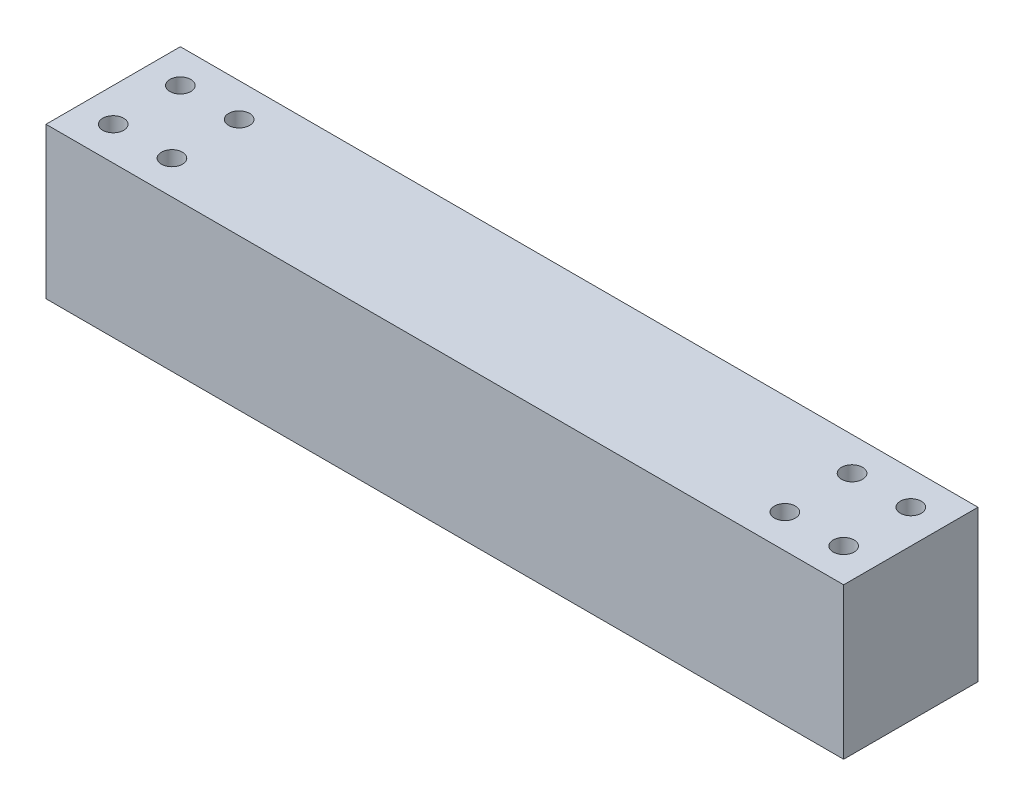
ISO-10303-21;
HEADER;
FILE_DESCRIPTION(('STEP AP214'),'2;1');
FILE_NAME('part.step','',(''),(''),'','','');
FILE_SCHEMA(('AUTOMOTIVE_DESIGN { 1 0 10303 214 1 1 1 1 }'));
ENDSEC;
DATA;
#1=APPLICATION_CONTEXT('core data for automotive mechanical design processes');
#2=APPLICATION_PROTOCOL_DEFINITION('international standard','automotive_design',2000,#1);
#3=PRODUCT_CONTEXT('',#1,'mechanical');
#4=PRODUCT('Part','Part','',(#3));
#5=PRODUCT_RELATED_PRODUCT_CATEGORY('part','',(#4));
#6=PRODUCT_DEFINITION_FORMATION('','',#4);
#7=PRODUCT_DEFINITION_CONTEXT('part definition',#1,'design');
#8=PRODUCT_DEFINITION('design','',#6,#7);
#9=PRODUCT_DEFINITION_SHAPE('','',#8);
#10=(LENGTH_UNIT() NAMED_UNIT(*) SI_UNIT(.MILLI.,.METRE.));
#11=(NAMED_UNIT(*) PLANE_ANGLE_UNIT() SI_UNIT($,.RADIAN.));
#12=(NAMED_UNIT(*) SI_UNIT($,.STERADIAN.) SOLID_ANGLE_UNIT());
#13=UNCERTAINTY_MEASURE_WITH_UNIT(LENGTH_MEASURE(1.E-05),#10,'distance_accuracy_value','');
#14=(GEOMETRIC_REPRESENTATION_CONTEXT(3) GLOBAL_UNCERTAINTY_ASSIGNED_CONTEXT((#13)) GLOBAL_UNIT_ASSIGNED_CONTEXT((#10,
#11,#12)) REPRESENTATION_CONTEXT('',''));
#15=CARTESIAN_POINT('',(0.,0.,0.));
#16=DIRECTION('',(0.,0.,1.));
#17=DIRECTION('',(1.,0.,0.));
#18=AXIS2_PLACEMENT_3D('',#15,#16,#17);
#19=CARTESIAN_POINT('',(0.,180.,160.));
#20=DIRECTION('',(0.,-1.,0.));
#21=DIRECTION('',(0.,0.,-1.));
#22=AXIS2_PLACEMENT_3D('',#19,#20,#21);
#23=PLANE('',#22);
#24=CARTESIAN_POINT('',(110.,180.,40.));
#25=DIRECTION('',(0.,1.,0.));
#26=DIRECTION('',(0.,0.,1.));
#27=AXIS2_PLACEMENT_3D('',#24,#25,#26);
#28=CIRCLE('',#27,12.5);
#29=CARTESIAN_POINT('',(110.,180.,52.5));
#30=VERTEX_POINT('',#29);
#31=EDGE_CURVE('E175',#30,#30,#28,.T.);
#32=ORIENTED_EDGE('',*,*,#31,.F.);
#33=EDGE_LOOP('',(#32));
#34=FACE_BOUND('',#33,.T.);
#35=CARTESIAN_POINT('',(840.,180.,120.));
#36=DIRECTION('',(0.,1.,0.));
#37=DIRECTION('',(0.,0.,1.));
#38=AXIS2_PLACEMENT_3D('',#35,#36,#37);
#39=CIRCLE('',#38,12.5);
#40=CARTESIAN_POINT('',(840.,180.,132.5));
#41=VERTEX_POINT('',#40);
#42=EDGE_CURVE('E103',#41,#41,#39,.T.);
#43=ORIENTED_EDGE('',*,*,#42,.F.);
#44=EDGE_LOOP('',(#43));
#45=FACE_BOUND('',#44,.T.);
#46=DIRECTION('',(-1.,0.,0.));
#47=VECTOR('',#46,1.);
#48=CARTESIAN_POINT('',(0.,180.,0.));
#49=LINE('',#48,#47);
#50=CARTESIAN_POINT('',(950.,180.,0.));
#51=VERTEX_POINT('',#50);
#52=CARTESIAN_POINT('',(0.,180.,0.));
#53=VERTEX_POINT('',#52);
#54=EDGE_CURVE('E57',#51,#53,#49,.T.);
#55=ORIENTED_EDGE('',*,*,#54,.T.);
#56=DIRECTION('',(0.,0.,-1.));
#57=VECTOR('',#56,1.);
#58=CARTESIAN_POINT('',(0.,180.,160.));
#59=LINE('',#58,#57);
#60=CARTESIAN_POINT('',(0.,180.,160.));
#61=VERTEX_POINT('',#60);
#62=EDGE_CURVE('E77',#61,#53,#59,.T.);
#63=ORIENTED_EDGE('',*,*,#62,.F.);
#64=DIRECTION('',(-1.,0.,0.));
#65=VECTOR('',#64,1.);
#66=CARTESIAN_POINT('',(0.,180.,160.));
#67=LINE('',#66,#65);
#68=CARTESIAN_POINT('',(950.,180.,160.));
#69=VERTEX_POINT('',#68);
#70=EDGE_CURVE('E34',#69,#61,#67,.T.);
#71=ORIENTED_EDGE('',*,*,#70,.F.);
#72=DIRECTION('',(0.,0.,-1.));
#73=VECTOR('',#72,1.);
#74=CARTESIAN_POINT('',(950.,180.,160.));
#75=LINE('',#74,#73);
#76=EDGE_CURVE('E74',#69,#51,#75,.T.);
#77=ORIENTED_EDGE('',*,*,#76,.T.);
#78=EDGE_LOOP('',(#55,#63,#71,#77));
#79=FACE_BOUND('',#78,.T.);
#80=CARTESIAN_POINT('',(910.,180.,120.));
#81=DIRECTION('',(0.,1.,0.));
#82=DIRECTION('',(0.,0.,1.));
#83=AXIS2_PLACEMENT_3D('',#80,#81,#82);
#84=CIRCLE('',#83,12.5);
#85=CARTESIAN_POINT('',(910.,180.,132.5));
#86=VERTEX_POINT('',#85);
#87=EDGE_CURVE('E115',#86,#86,#84,.T.);
#88=ORIENTED_EDGE('',*,*,#87,.F.);
#89=EDGE_LOOP('',(#88));
#90=FACE_BOUND('',#89,.T.);
#91=CARTESIAN_POINT('',(910.,180.,40.));
#92=DIRECTION('',(0.,1.,0.));
#93=DIRECTION('',(0.,0.,1.));
#94=AXIS2_PLACEMENT_3D('',#91,#92,#93);
#95=CIRCLE('',#94,12.5);
#96=CARTESIAN_POINT('',(910.,180.,52.5));
#97=VERTEX_POINT('',#96);
#98=EDGE_CURVE('E127',#97,#97,#95,.T.);
#99=ORIENTED_EDGE('',*,*,#98,.F.);
#100=EDGE_LOOP('',(#99));
#101=FACE_BOUND('',#100,.T.);
#102=CARTESIAN_POINT('',(840.,180.,40.));
#103=DIRECTION('',(0.,1.,0.));
#104=DIRECTION('',(0.,0.,1.));
#105=AXIS2_PLACEMENT_3D('',#102,#103,#104);
#106=CIRCLE('',#105,12.5);
#107=CARTESIAN_POINT('',(840.,180.,52.5));
#108=VERTEX_POINT('',#107);
#109=EDGE_CURVE('E139',#108,#108,#106,.T.);
#110=ORIENTED_EDGE('',*,*,#109,.F.);
#111=EDGE_LOOP('',(#110));
#112=FACE_BOUND('',#111,.T.);
#113=CARTESIAN_POINT('',(110.,180.,120.));
#114=DIRECTION('',(0.,1.,0.));
#115=DIRECTION('',(0.,0.,1.));
#116=AXIS2_PLACEMENT_3D('',#113,#114,#115);
#117=CIRCLE('',#116,12.5);
#118=CARTESIAN_POINT('',(110.,180.,132.5));
#119=VERTEX_POINT('',#118);
#120=EDGE_CURVE('E151',#119,#119,#117,.T.);
#121=ORIENTED_EDGE('',*,*,#120,.F.);
#122=EDGE_LOOP('',(#121));
#123=FACE_BOUND('',#122,.T.);
#124=CARTESIAN_POINT('',(40.,180.,120.));
#125=DIRECTION('',(0.,1.,0.));
#126=DIRECTION('',(0.,0.,1.));
#127=AXIS2_PLACEMENT_3D('',#124,#125,#126);
#128=CIRCLE('',#127,12.5);
#129=CARTESIAN_POINT('',(40.,180.,132.5));
#130=VERTEX_POINT('',#129);
#131=EDGE_CURVE('E163',#130,#130,#128,.T.);
#132=ORIENTED_EDGE('',*,*,#131,.F.);
#133=EDGE_LOOP('',(#132));
#134=FACE_BOUND('',#133,.T.);
#135=CARTESIAN_POINT('',(40.,180.,40.));
#136=DIRECTION('',(0.,1.,0.));
#137=DIRECTION('',(0.,0.,1.));
#138=AXIS2_PLACEMENT_3D('',#135,#136,#137);
#139=CIRCLE('',#138,12.5);
#140=CARTESIAN_POINT('',(40.,180.,52.5));
#141=VERTEX_POINT('',#140);
#142=EDGE_CURVE('E187',#141,#141,#139,.T.);
#143=ORIENTED_EDGE('',*,*,#142,.F.);
#144=EDGE_LOOP('',(#143));
#145=FACE_BOUND('',#144,.T.);
#146=ADVANCED_FACE('F17',(#34,#45,#79,#90,#101,#112,#123,#134,#145),#23,.F.);
#147=CARTESIAN_POINT('',(0.,0.,160.));
#148=DIRECTION('',(1.,0.,0.));
#149=DIRECTION('',(0.,0.,-1.));
#150=AXIS2_PLACEMENT_3D('',#147,#148,#149);
#151=PLANE('',#150);
#152=DIRECTION('',(0.,-1.,0.));
#153=VECTOR('',#152,1.);
#154=CARTESIAN_POINT('',(0.,0.,0.));
#155=LINE('',#154,#153);
#156=CARTESIAN_POINT('',(0.,0.,0.));
#157=VERTEX_POINT('',#156);
#158=EDGE_CURVE('E81',#53,#157,#155,.T.);
#159=ORIENTED_EDGE('',*,*,#158,.T.);
#160=DIRECTION('',(0.,0.,-1.));
#161=VECTOR('',#160,1.);
#162=CARTESIAN_POINT('',(0.,0.,160.));
#163=LINE('',#162,#161);
#164=CARTESIAN_POINT('',(0.,0.,160.));
#165=VERTEX_POINT('',#164);
#166=EDGE_CURVE('E11',#165,#157,#163,.T.);
#167=ORIENTED_EDGE('',*,*,#166,.F.);
#168=DIRECTION('',(0.,-1.,0.));
#169=VECTOR('',#168,1.);
#170=CARTESIAN_POINT('',(0.,0.,160.));
#171=LINE('',#170,#169);
#172=EDGE_CURVE('E69',#61,#165,#171,.T.);
#173=ORIENTED_EDGE('',*,*,#172,.F.);
#174=ORIENTED_EDGE('',*,*,#62,.T.);
#175=EDGE_LOOP('',(#159,#167,#173,#174));
#176=FACE_BOUND('',#175,.T.);
#177=ADVANCED_FACE('F19',(#176),#151,.F.);
#178=CARTESIAN_POINT('',(0.,0.,160.));
#179=DIRECTION('',(0.,1.,0.));
#180=DIRECTION('',(0.,0.,1.));
#181=AXIS2_PLACEMENT_3D('',#178,#179,#180);
#182=PLANE('',#181);
#183=CARTESIAN_POINT('',(40.,0.,40.));
#184=DIRECTION('',(0.,1.,0.));
#185=DIRECTION('',(0.,0.,1.));
#186=AXIS2_PLACEMENT_3D('',#183,#184,#185);
#187=CIRCLE('',#186,6.75);
#188=CARTESIAN_POINT('',(40.,0.,46.75));
#189=VERTEX_POINT('',#188);
#190=EDGE_CURVE('E178',#189,#189,#187,.T.);
#191=ORIENTED_EDGE('',*,*,#190,.T.);
#192=EDGE_LOOP('',(#191));
#193=FACE_BOUND('',#192,.T.);
#194=CARTESIAN_POINT('',(110.,0.,40.));
#195=DIRECTION('',(0.,1.,0.));
#196=DIRECTION('',(0.,0.,1.));
#197=AXIS2_PLACEMENT_3D('',#194,#195,#196);
#198=CIRCLE('',#197,6.75);
#199=CARTESIAN_POINT('',(110.,0.,46.75));
#200=VERTEX_POINT('',#199);
#201=EDGE_CURVE('E166',#200,#200,#198,.T.);
#202=ORIENTED_EDGE('',*,*,#201,.T.);
#203=EDGE_LOOP('',(#202));
#204=FACE_BOUND('',#203,.T.);
#205=CARTESIAN_POINT('',(40.,0.,120.));
#206=DIRECTION('',(0.,1.,0.));
#207=DIRECTION('',(0.,0.,1.));
#208=AXIS2_PLACEMENT_3D('',#205,#206,#207);
#209=CIRCLE('',#208,6.75);
#210=CARTESIAN_POINT('',(40.,0.,126.75));
#211=VERTEX_POINT('',#210);
#212=EDGE_CURVE('E154',#211,#211,#209,.T.);
#213=ORIENTED_EDGE('',*,*,#212,.T.);
#214=EDGE_LOOP('',(#213));
#215=FACE_BOUND('',#214,.T.);
#216=CARTESIAN_POINT('',(110.,0.,120.));
#217=DIRECTION('',(0.,1.,0.));
#218=DIRECTION('',(0.,0.,1.));
#219=AXIS2_PLACEMENT_3D('',#216,#217,#218);
#220=CIRCLE('',#219,6.75);
#221=CARTESIAN_POINT('',(110.,0.,126.75));
#222=VERTEX_POINT('',#221);
#223=EDGE_CURVE('E142',#222,#222,#220,.T.);
#224=ORIENTED_EDGE('',*,*,#223,.T.);
#225=EDGE_LOOP('',(#224));
#226=FACE_BOUND('',#225,.T.);
#227=CARTESIAN_POINT('',(840.,0.,40.));
#228=DIRECTION('',(0.,1.,0.));
#229=DIRECTION('',(0.,0.,1.));
#230=AXIS2_PLACEMENT_3D('',#227,#228,#229);
#231=CIRCLE('',#230,6.74999999999992);
#232=CARTESIAN_POINT('',(840.,0.,46.7499999999999));
#233=VERTEX_POINT('',#232);
#234=EDGE_CURVE('E130',#233,#233,#231,.T.);
#235=ORIENTED_EDGE('',*,*,#234,.T.);
#236=EDGE_LOOP('',(#235));
#237=FACE_BOUND('',#236,.T.);
#238=CARTESIAN_POINT('',(910.,0.,40.));
#239=DIRECTION('',(0.,1.,0.));
#240=DIRECTION('',(0.,0.,1.));
#241=AXIS2_PLACEMENT_3D('',#238,#239,#240);
#242=CIRCLE('',#241,6.74999999999992);
#243=CARTESIAN_POINT('',(910.,0.,46.7499999999999));
#244=VERTEX_POINT('',#243);
#245=EDGE_CURVE('E118',#244,#244,#242,.T.);
#246=ORIENTED_EDGE('',*,*,#245,.T.);
#247=EDGE_LOOP('',(#246));
#248=FACE_BOUND('',#247,.T.);
#249=CARTESIAN_POINT('',(910.,0.,120.));
#250=DIRECTION('',(0.,1.,0.));
#251=DIRECTION('',(0.,0.,1.));
#252=AXIS2_PLACEMENT_3D('',#249,#250,#251);
#253=CIRCLE('',#252,6.74999999999992);
#254=CARTESIAN_POINT('',(910.,0.,126.75));
#255=VERTEX_POINT('',#254);
#256=EDGE_CURVE('E106',#255,#255,#253,.T.);
#257=ORIENTED_EDGE('',*,*,#256,.T.);
#258=EDGE_LOOP('',(#257));
#259=FACE_BOUND('',#258,.T.);
#260=CARTESIAN_POINT('',(840.,0.,120.));
#261=DIRECTION('',(0.,1.,0.));
#262=DIRECTION('',(0.,0.,1.));
#263=AXIS2_PLACEMENT_3D('',#260,#261,#262);
#264=CIRCLE('',#263,6.74999999999992);
#265=CARTESIAN_POINT('',(840.,0.,126.75));
#266=VERTEX_POINT('',#265);
#267=EDGE_CURVE('E84',#266,#266,#264,.T.);
#268=ORIENTED_EDGE('',*,*,#267,.T.);
#269=EDGE_LOOP('',(#268));
#270=FACE_BOUND('',#269,.T.);
#271=DIRECTION('',(1.,0.,0.));
#272=VECTOR('',#271,1.);
#273=CARTESIAN_POINT('',(0.,0.,0.));
#274=LINE('',#273,#272);
#275=CARTESIAN_POINT('',(950.,0.,0.));
#276=VERTEX_POINT('',#275);
#277=EDGE_CURVE('E73',#157,#276,#274,.T.);
#278=ORIENTED_EDGE('',*,*,#277,.T.);
#279=DIRECTION('',(0.,0.,-1.));
#280=VECTOR('',#279,1.);
#281=CARTESIAN_POINT('',(950.,0.,160.));
#282=LINE('',#281,#280);
#283=CARTESIAN_POINT('',(950.,0.,160.));
#284=VERTEX_POINT('',#283);
#285=EDGE_CURVE('E26',#284,#276,#282,.T.);
#286=ORIENTED_EDGE('',*,*,#285,.F.);
#287=DIRECTION('',(1.,0.,0.));
#288=VECTOR('',#287,1.);
#289=CARTESIAN_POINT('',(0.,0.,160.));
#290=LINE('',#289,#288);
#291=EDGE_CURVE('E64',#165,#284,#290,.T.);
#292=ORIENTED_EDGE('',*,*,#291,.F.);
#293=ORIENTED_EDGE('',*,*,#166,.T.);
#294=EDGE_LOOP('',(#278,#286,#292,#293));
#295=FACE_BOUND('',#294,.T.);
#296=ADVANCED_FACE('F72',(#193,#204,#215,#226,#237,#248,#259,#270,#295),#182,.F.);
#297=CARTESIAN_POINT('',(950.,0.,160.));
#298=DIRECTION('',(-1.,0.,0.));
#299=DIRECTION('',(0.,0.,1.));
#300=AXIS2_PLACEMENT_3D('',#297,#298,#299);
#301=PLANE('',#300);
#302=DIRECTION('',(0.,1.,0.));
#303=VECTOR('',#302,1.);
#304=CARTESIAN_POINT('',(950.,0.,0.));
#305=LINE('',#304,#303);
#306=EDGE_CURVE('E51',#276,#51,#305,.T.);
#307=ORIENTED_EDGE('',*,*,#306,.T.);
#308=ORIENTED_EDGE('',*,*,#76,.F.);
#309=DIRECTION('',(0.,1.,0.));
#310=VECTOR('',#309,1.);
#311=CARTESIAN_POINT('',(950.,0.,160.));
#312=LINE('',#311,#310);
#313=EDGE_CURVE('E67',#284,#69,#312,.T.);
#314=ORIENTED_EDGE('',*,*,#313,.F.);
#315=ORIENTED_EDGE('',*,*,#285,.T.);
#316=EDGE_LOOP('',(#307,#308,#314,#315));
#317=FACE_BOUND('',#316,.T.);
#318=ADVANCED_FACE('F75',(#317),#301,.F.);
#319=CARTESIAN_POINT('',(0.,0.,160.));
#320=DIRECTION('',(0.,0.,-1.));
#321=DIRECTION('',(-1.,0.,0.));
#322=AXIS2_PLACEMENT_3D('',#319,#320,#321);
#323=PLANE('',#322);
#324=ORIENTED_EDGE('',*,*,#172,.T.);
#325=ORIENTED_EDGE('',*,*,#291,.T.);
#326=ORIENTED_EDGE('',*,*,#313,.T.);
#327=ORIENTED_EDGE('',*,*,#70,.T.);
#328=EDGE_LOOP('',(#324,#325,#326,#327));
#329=FACE_BOUND('',#328,.T.);
#330=ADVANCED_FACE('F65',(#329),#323,.F.);
#331=CARTESIAN_POINT('',(0.,0.,0.));
#332=DIRECTION('',(0.,0.,-1.));
#333=DIRECTION('',(-1.,0.,0.));
#334=AXIS2_PLACEMENT_3D('',#331,#332,#333);
#335=PLANE('',#334);
#336=ORIENTED_EDGE('',*,*,#158,.F.);
#337=ORIENTED_EDGE('',*,*,#54,.F.);
#338=ORIENTED_EDGE('',*,*,#306,.F.);
#339=ORIENTED_EDGE('',*,*,#277,.F.);
#340=EDGE_LOOP('',(#336,#337,#338,#339));
#341=FACE_BOUND('',#340,.T.);
#342=ADVANCED_FACE('F92',(#341),#335,.T.);
#343=CARTESIAN_POINT('',(840.,180.,120.));
#344=DIRECTION('',(0.,1.,0.));
#345=DIRECTION('',(0.,0.,1.));
#346=AXIS2_PLACEMENT_3D('',#343,#344,#345);
#347=CYLINDRICAL_SURFACE('',#346,6.74999999999992);
#348=ORIENTED_EDGE('',*,*,#267,.F.);
#349=EDGE_LOOP('',(#348));
#350=FACE_BOUND('',#349,.T.);
#351=CARTESIAN_POINT('',(840.,80.,120.));
#352=DIRECTION('',(0.,1.,0.));
#353=DIRECTION('',(0.,0.,1.));
#354=AXIS2_PLACEMENT_3D('',#351,#352,#353);
#355=CIRCLE('',#354,6.74999999999992);
#356=CARTESIAN_POINT('',(840.,80.,126.75));
#357=VERTEX_POINT('',#356);
#358=EDGE_CURVE('E97',#357,#357,#355,.T.);
#359=ORIENTED_EDGE('',*,*,#358,.T.);
#360=EDGE_LOOP('',(#359));
#361=FACE_BOUND('',#360,.T.);
#362=ADVANCED_FACE('F226',(#350,#361),#347,.F.);
#363=CARTESIAN_POINT('',(846.75,80.,120.));
#364=DIRECTION('',(0.,-1.,0.));
#365=DIRECTION('',(0.,0.,-1.));
#366=AXIS2_PLACEMENT_3D('',#363,#364,#365);
#367=PLANE('',#366);
#368=ORIENTED_EDGE('',*,*,#358,.F.);
#369=EDGE_LOOP('',(#368));
#370=FACE_BOUND('',#369,.T.);
#371=CARTESIAN_POINT('',(840.,80.,120.));
#372=DIRECTION('',(0.,1.,0.));
#373=DIRECTION('',(0.,0.,1.));
#374=AXIS2_PLACEMENT_3D('',#371,#372,#373);
#375=CIRCLE('',#374,12.5);
#376=CARTESIAN_POINT('',(840.,80.,132.5));
#377=VERTEX_POINT('',#376);
#378=EDGE_CURVE('E100',#377,#377,#375,.T.);
#379=ORIENTED_EDGE('',*,*,#378,.T.);
#380=EDGE_LOOP('',(#379));
#381=FACE_BOUND('',#380,.T.);
#382=ADVANCED_FACE('F229',(#370,#381),#367,.F.);
#383=CARTESIAN_POINT('',(840.,180.,120.));
#384=DIRECTION('',(0.,1.,0.));
#385=DIRECTION('',(0.,0.,1.));
#386=AXIS2_PLACEMENT_3D('',#383,#384,#385);
#387=CYLINDRICAL_SURFACE('',#386,12.5);
#388=ORIENTED_EDGE('',*,*,#378,.F.);
#389=EDGE_LOOP('',(#388));
#390=FACE_BOUND('',#389,.T.);
#391=ORIENTED_EDGE('',*,*,#42,.T.);
#392=EDGE_LOOP('',(#391));
#393=FACE_BOUND('',#392,.T.);
#394=ADVANCED_FACE('F235',(#390,#393),#387,.F.);
#395=CARTESIAN_POINT('',(910.,180.,120.));
#396=DIRECTION('',(0.,1.,0.));
#397=DIRECTION('',(0.,0.,1.));
#398=AXIS2_PLACEMENT_3D('',#395,#396,#397);
#399=CYLINDRICAL_SURFACE('',#398,6.74999999999992);
#400=ORIENTED_EDGE('',*,*,#256,.F.);
#401=EDGE_LOOP('',(#400));
#402=FACE_BOUND('',#401,.T.);
#403=CARTESIAN_POINT('',(910.,80.,120.));
#404=DIRECTION('',(0.,1.,0.));
#405=DIRECTION('',(0.,0.,1.));
#406=AXIS2_PLACEMENT_3D('',#403,#404,#405);
#407=CIRCLE('',#406,6.74999999999992);
#408=CARTESIAN_POINT('',(910.,80.,126.75));
#409=VERTEX_POINT('',#408);
#410=EDGE_CURVE('E109',#409,#409,#407,.T.);
#411=ORIENTED_EDGE('',*,*,#410,.T.);
#412=EDGE_LOOP('',(#411));
#413=FACE_BOUND('',#412,.T.);
#414=ADVANCED_FACE('F241',(#402,#413),#399,.F.);
#415=CARTESIAN_POINT('',(916.75,80.,120.));
#416=DIRECTION('',(0.,-1.,0.));
#417=DIRECTION('',(0.,0.,-1.));
#418=AXIS2_PLACEMENT_3D('',#415,#416,#417);
#419=PLANE('',#418);
#420=ORIENTED_EDGE('',*,*,#410,.F.);
#421=EDGE_LOOP('',(#420));
#422=FACE_BOUND('',#421,.T.);
#423=CARTESIAN_POINT('',(910.,80.,120.));
#424=DIRECTION('',(0.,1.,0.));
#425=DIRECTION('',(0.,0.,1.));
#426=AXIS2_PLACEMENT_3D('',#423,#424,#425);
#427=CIRCLE('',#426,12.5);
#428=CARTESIAN_POINT('',(910.,80.,132.5));
#429=VERTEX_POINT('',#428);
#430=EDGE_CURVE('E112',#429,#429,#427,.T.);
#431=ORIENTED_EDGE('',*,*,#430,.T.);
#432=EDGE_LOOP('',(#431));
#433=FACE_BOUND('',#432,.T.);
#434=ADVANCED_FACE('F247',(#422,#433),#419,.F.);
#435=CARTESIAN_POINT('',(910.,180.,120.));
#436=DIRECTION('',(0.,1.,0.));
#437=DIRECTION('',(0.,0.,1.));
#438=AXIS2_PLACEMENT_3D('',#435,#436,#437);
#439=CYLINDRICAL_SURFACE('',#438,12.5);
#440=ORIENTED_EDGE('',*,*,#430,.F.);
#441=EDGE_LOOP('',(#440));
#442=FACE_BOUND('',#441,.T.);
#443=ORIENTED_EDGE('',*,*,#87,.T.);
#444=EDGE_LOOP('',(#443));
#445=FACE_BOUND('',#444,.T.);
#446=ADVANCED_FACE('F293',(#442,#445),#439,.F.);
#447=CARTESIAN_POINT('',(910.,180.,40.));
#448=DIRECTION('',(0.,1.,0.));
#449=DIRECTION('',(0.,0.,1.));
#450=AXIS2_PLACEMENT_3D('',#447,#448,#449);
#451=CYLINDRICAL_SURFACE('',#450,6.74999999999992);
#452=ORIENTED_EDGE('',*,*,#245,.F.);
#453=EDGE_LOOP('',(#452));
#454=FACE_BOUND('',#453,.T.);
#455=CARTESIAN_POINT('',(910.,80.,40.));
#456=DIRECTION('',(0.,1.,0.));
#457=DIRECTION('',(0.,0.,1.));
#458=AXIS2_PLACEMENT_3D('',#455,#456,#457);
#459=CIRCLE('',#458,6.74999999999992);
#460=CARTESIAN_POINT('',(910.,80.,46.7499999999999));
#461=VERTEX_POINT('',#460);
#462=EDGE_CURVE('E121',#461,#461,#459,.T.);
#463=ORIENTED_EDGE('',*,*,#462,.T.);
#464=EDGE_LOOP('',(#463));
#465=FACE_BOUND('',#464,.T.);
#466=ADVANCED_FACE('F302',(#454,#465),#451,.F.);
#467=CARTESIAN_POINT('',(916.75,80.,40.));
#468=DIRECTION('',(0.,-1.,0.));
#469=DIRECTION('',(0.,0.,-1.));
#470=AXIS2_PLACEMENT_3D('',#467,#468,#469);
#471=PLANE('',#470);
#472=ORIENTED_EDGE('',*,*,#462,.F.);
#473=EDGE_LOOP('',(#472));
#474=FACE_BOUND('',#473,.T.);
#475=CARTESIAN_POINT('',(910.,80.,40.));
#476=DIRECTION('',(0.,1.,0.));
#477=DIRECTION('',(0.,0.,1.));
#478=AXIS2_PLACEMENT_3D('',#475,#476,#477);
#479=CIRCLE('',#478,12.5);
#480=CARTESIAN_POINT('',(910.,80.,52.5));
#481=VERTEX_POINT('',#480);
#482=EDGE_CURVE('E124',#481,#481,#479,.T.);
#483=ORIENTED_EDGE('',*,*,#482,.T.);
#484=EDGE_LOOP('',(#483));
#485=FACE_BOUND('',#484,.T.);
#486=ADVANCED_FACE('F312',(#474,#485),#471,.F.);
#487=CARTESIAN_POINT('',(910.,180.,40.));
#488=DIRECTION('',(0.,1.,0.));
#489=DIRECTION('',(0.,0.,1.));
#490=AXIS2_PLACEMENT_3D('',#487,#488,#489);
#491=CYLINDRICAL_SURFACE('',#490,12.5);
#492=ORIENTED_EDGE('',*,*,#482,.F.);
#493=EDGE_LOOP('',(#492));
#494=FACE_BOUND('',#493,.T.);
#495=ORIENTED_EDGE('',*,*,#98,.T.);
#496=EDGE_LOOP('',(#495));
#497=FACE_BOUND('',#496,.T.);
#498=ADVANCED_FACE('F322',(#494,#497),#491,.F.);
#499=CARTESIAN_POINT('',(840.,180.,40.));
#500=DIRECTION('',(0.,1.,0.));
#501=DIRECTION('',(0.,0.,1.));
#502=AXIS2_PLACEMENT_3D('',#499,#500,#501);
#503=CYLINDRICAL_SURFACE('',#502,6.74999999999992);
#504=ORIENTED_EDGE('',*,*,#234,.F.);
#505=EDGE_LOOP('',(#504));
#506=FACE_BOUND('',#505,.T.);
#507=CARTESIAN_POINT('',(840.,80.,40.));
#508=DIRECTION('',(0.,1.,0.));
#509=DIRECTION('',(0.,0.,1.));
#510=AXIS2_PLACEMENT_3D('',#507,#508,#509);
#511=CIRCLE('',#510,6.74999999999992);
#512=CARTESIAN_POINT('',(840.,80.,46.7499999999999));
#513=VERTEX_POINT('',#512);
#514=EDGE_CURVE('E133',#513,#513,#511,.T.);
#515=ORIENTED_EDGE('',*,*,#514,.T.);
#516=EDGE_LOOP('',(#515));
#517=FACE_BOUND('',#516,.T.);
#518=ADVANCED_FACE('F332',(#506,#517),#503,.F.);
#519=CARTESIAN_POINT('',(846.75,80.,40.));
#520=DIRECTION('',(0.,-1.,0.));
#521=DIRECTION('',(0.,0.,-1.));
#522=AXIS2_PLACEMENT_3D('',#519,#520,#521);
#523=PLANE('',#522);
#524=ORIENTED_EDGE('',*,*,#514,.F.);
#525=EDGE_LOOP('',(#524));
#526=FACE_BOUND('',#525,.T.);
#527=CARTESIAN_POINT('',(840.,80.,40.));
#528=DIRECTION('',(0.,1.,0.));
#529=DIRECTION('',(0.,0.,1.));
#530=AXIS2_PLACEMENT_3D('',#527,#528,#529);
#531=CIRCLE('',#530,12.5);
#532=CARTESIAN_POINT('',(840.,80.,52.5));
#533=VERTEX_POINT('',#532);
#534=EDGE_CURVE('E136',#533,#533,#531,.T.);
#535=ORIENTED_EDGE('',*,*,#534,.T.);
#536=EDGE_LOOP('',(#535));
#537=FACE_BOUND('',#536,.T.);
#538=ADVANCED_FACE('F342',(#526,#537),#523,.F.);
#539=CARTESIAN_POINT('',(840.,180.,40.));
#540=DIRECTION('',(0.,1.,0.));
#541=DIRECTION('',(0.,0.,1.));
#542=AXIS2_PLACEMENT_3D('',#539,#540,#541);
#543=CYLINDRICAL_SURFACE('',#542,12.5);
#544=ORIENTED_EDGE('',*,*,#534,.F.);
#545=EDGE_LOOP('',(#544));
#546=FACE_BOUND('',#545,.T.);
#547=ORIENTED_EDGE('',*,*,#109,.T.);
#548=EDGE_LOOP('',(#547));
#549=FACE_BOUND('',#548,.T.);
#550=ADVANCED_FACE('F352',(#546,#549),#543,.F.);
#551=CARTESIAN_POINT('',(110.,180.,120.));
#552=DIRECTION('',(0.,1.,0.));
#553=DIRECTION('',(0.,0.,1.));
#554=AXIS2_PLACEMENT_3D('',#551,#552,#553);
#555=CYLINDRICAL_SURFACE('',#554,6.75);
#556=ORIENTED_EDGE('',*,*,#223,.F.);
#557=EDGE_LOOP('',(#556));
#558=FACE_BOUND('',#557,.T.);
#559=CARTESIAN_POINT('',(110.,80.,120.));
#560=DIRECTION('',(0.,1.,0.));
#561=DIRECTION('',(0.,0.,1.));
#562=AXIS2_PLACEMENT_3D('',#559,#560,#561);
#563=CIRCLE('',#562,6.75);
#564=CARTESIAN_POINT('',(110.,80.,126.75));
#565=VERTEX_POINT('',#564);
#566=EDGE_CURVE('E145',#565,#565,#563,.T.);
#567=ORIENTED_EDGE('',*,*,#566,.T.);
#568=EDGE_LOOP('',(#567));
#569=FACE_BOUND('',#568,.T.);
#570=ADVANCED_FACE('F362',(#558,#569),#555,.F.);
#571=CARTESIAN_POINT('',(116.75,80.,120.));
#572=DIRECTION('',(0.,-1.,0.));
#573=DIRECTION('',(0.,0.,-1.));
#574=AXIS2_PLACEMENT_3D('',#571,#572,#573);
#575=PLANE('',#574);
#576=ORIENTED_EDGE('',*,*,#566,.F.);
#577=EDGE_LOOP('',(#576));
#578=FACE_BOUND('',#577,.T.);
#579=CARTESIAN_POINT('',(110.,80.,120.));
#580=DIRECTION('',(0.,1.,0.));
#581=DIRECTION('',(0.,0.,1.));
#582=AXIS2_PLACEMENT_3D('',#579,#580,#581);
#583=CIRCLE('',#582,12.5);
#584=CARTESIAN_POINT('',(110.,80.,132.5));
#585=VERTEX_POINT('',#584);
#586=EDGE_CURVE('E148',#585,#585,#583,.T.);
#587=ORIENTED_EDGE('',*,*,#586,.T.);
#588=EDGE_LOOP('',(#587));
#589=FACE_BOUND('',#588,.T.);
#590=ADVANCED_FACE('F372',(#578,#589),#575,.F.);
#591=CARTESIAN_POINT('',(110.,180.,120.));
#592=DIRECTION('',(0.,1.,0.));
#593=DIRECTION('',(0.,0.,1.));
#594=AXIS2_PLACEMENT_3D('',#591,#592,#593);
#595=CYLINDRICAL_SURFACE('',#594,12.5);
#596=ORIENTED_EDGE('',*,*,#586,.F.);
#597=EDGE_LOOP('',(#596));
#598=FACE_BOUND('',#597,.T.);
#599=ORIENTED_EDGE('',*,*,#120,.T.);
#600=EDGE_LOOP('',(#599));
#601=FACE_BOUND('',#600,.T.);
#602=ADVANCED_FACE('F382',(#598,#601),#595,.F.);
#603=CARTESIAN_POINT('',(40.,180.,120.));
#604=DIRECTION('',(0.,1.,0.));
#605=DIRECTION('',(0.,0.,1.));
#606=AXIS2_PLACEMENT_3D('',#603,#604,#605);
#607=CYLINDRICAL_SURFACE('',#606,6.75);
#608=ORIENTED_EDGE('',*,*,#212,.F.);
#609=EDGE_LOOP('',(#608));
#610=FACE_BOUND('',#609,.T.);
#611=CARTESIAN_POINT('',(40.,80.,120.));
#612=DIRECTION('',(0.,1.,0.));
#613=DIRECTION('',(0.,0.,1.));
#614=AXIS2_PLACEMENT_3D('',#611,#612,#613);
#615=CIRCLE('',#614,6.75);
#616=CARTESIAN_POINT('',(40.,80.,126.75));
#617=VERTEX_POINT('',#616);
#618=EDGE_CURVE('E157',#617,#617,#615,.T.);
#619=ORIENTED_EDGE('',*,*,#618,.T.);
#620=EDGE_LOOP('',(#619));
#621=FACE_BOUND('',#620,.T.);
#622=ADVANCED_FACE('F392',(#610,#621),#607,.F.);
#623=CARTESIAN_POINT('',(46.75,80.,120.));
#624=DIRECTION('',(0.,-1.,0.));
#625=DIRECTION('',(0.,0.,-1.));
#626=AXIS2_PLACEMENT_3D('',#623,#624,#625);
#627=PLANE('',#626);
#628=ORIENTED_EDGE('',*,*,#618,.F.);
#629=EDGE_LOOP('',(#628));
#630=FACE_BOUND('',#629,.T.);
#631=CARTESIAN_POINT('',(40.,80.,120.));
#632=DIRECTION('',(0.,1.,0.));
#633=DIRECTION('',(0.,0.,1.));
#634=AXIS2_PLACEMENT_3D('',#631,#632,#633);
#635=CIRCLE('',#634,12.5);
#636=CARTESIAN_POINT('',(40.,80.,132.5));
#637=VERTEX_POINT('',#636);
#638=EDGE_CURVE('E160',#637,#637,#635,.T.);
#639=ORIENTED_EDGE('',*,*,#638,.T.);
#640=EDGE_LOOP('',(#639));
#641=FACE_BOUND('',#640,.T.);
#642=ADVANCED_FACE('F402',(#630,#641),#627,.F.);
#643=CARTESIAN_POINT('',(40.,180.,120.));
#644=DIRECTION('',(0.,1.,0.));
#645=DIRECTION('',(0.,0.,1.));
#646=AXIS2_PLACEMENT_3D('',#643,#644,#645);
#647=CYLINDRICAL_SURFACE('',#646,12.5);
#648=ORIENTED_EDGE('',*,*,#638,.F.);
#649=EDGE_LOOP('',(#648));
#650=FACE_BOUND('',#649,.T.);
#651=ORIENTED_EDGE('',*,*,#131,.T.);
#652=EDGE_LOOP('',(#651));
#653=FACE_BOUND('',#652,.T.);
#654=ADVANCED_FACE('F412',(#650,#653),#647,.F.);
#655=CARTESIAN_POINT('',(110.,180.,40.));
#656=DIRECTION('',(0.,1.,0.));
#657=DIRECTION('',(0.,0.,1.));
#658=AXIS2_PLACEMENT_3D('',#655,#656,#657);
#659=CYLINDRICAL_SURFACE('',#658,6.75);
#660=ORIENTED_EDGE('',*,*,#201,.F.);
#661=EDGE_LOOP('',(#660));
#662=FACE_BOUND('',#661,.T.);
#663=CARTESIAN_POINT('',(110.,80.,40.));
#664=DIRECTION('',(0.,1.,0.));
#665=DIRECTION('',(0.,0.,1.));
#666=AXIS2_PLACEMENT_3D('',#663,#664,#665);
#667=CIRCLE('',#666,6.75);
#668=CARTESIAN_POINT('',(110.,80.,46.75));
#669=VERTEX_POINT('',#668);
#670=EDGE_CURVE('E169',#669,#669,#667,.T.);
#671=ORIENTED_EDGE('',*,*,#670,.T.);
#672=EDGE_LOOP('',(#671));
#673=FACE_BOUND('',#672,.T.);
#674=ADVANCED_FACE('F422',(#662,#673),#659,.F.);
#675=CARTESIAN_POINT('',(116.75,80.,40.));
#676=DIRECTION('',(0.,-1.,0.));
#677=DIRECTION('',(0.,0.,-1.));
#678=AXIS2_PLACEMENT_3D('',#675,#676,#677);
#679=PLANE('',#678);
#680=ORIENTED_EDGE('',*,*,#670,.F.);
#681=EDGE_LOOP('',(#680));
#682=FACE_BOUND('',#681,.T.);
#683=CARTESIAN_POINT('',(110.,80.,40.));
#684=DIRECTION('',(0.,1.,0.));
#685=DIRECTION('',(0.,0.,1.));
#686=AXIS2_PLACEMENT_3D('',#683,#684,#685);
#687=CIRCLE('',#686,12.5);
#688=CARTESIAN_POINT('',(110.,80.,52.5));
#689=VERTEX_POINT('',#688);
#690=EDGE_CURVE('E172',#689,#689,#687,.T.);
#691=ORIENTED_EDGE('',*,*,#690,.T.);
#692=EDGE_LOOP('',(#691));
#693=FACE_BOUND('',#692,.T.);
#694=ADVANCED_FACE('F432',(#682,#693),#679,.F.);
#695=CARTESIAN_POINT('',(110.,180.,40.));
#696=DIRECTION('',(0.,1.,0.));
#697=DIRECTION('',(0.,0.,1.));
#698=AXIS2_PLACEMENT_3D('',#695,#696,#697);
#699=CYLINDRICAL_SURFACE('',#698,12.5);
#700=ORIENTED_EDGE('',*,*,#690,.F.);
#701=EDGE_LOOP('',(#700));
#702=FACE_BOUND('',#701,.T.);
#703=ORIENTED_EDGE('',*,*,#31,.T.);
#704=EDGE_LOOP('',(#703));
#705=FACE_BOUND('',#704,.T.);
#706=ADVANCED_FACE('F442',(#702,#705),#699,.F.);
#707=CARTESIAN_POINT('',(40.,180.,40.));
#708=DIRECTION('',(0.,1.,0.));
#709=DIRECTION('',(0.,0.,1.));
#710=AXIS2_PLACEMENT_3D('',#707,#708,#709);
#711=CYLINDRICAL_SURFACE('',#710,6.75);
#712=ORIENTED_EDGE('',*,*,#190,.F.);
#713=EDGE_LOOP('',(#712));
#714=FACE_BOUND('',#713,.T.);
#715=CARTESIAN_POINT('',(40.,80.,40.));
#716=DIRECTION('',(0.,1.,0.));
#717=DIRECTION('',(0.,0.,1.));
#718=AXIS2_PLACEMENT_3D('',#715,#716,#717);
#719=CIRCLE('',#718,6.75);
#720=CARTESIAN_POINT('',(40.,80.,46.75));
#721=VERTEX_POINT('',#720);
#722=EDGE_CURVE('E181',#721,#721,#719,.T.);
#723=ORIENTED_EDGE('',*,*,#722,.T.);
#724=EDGE_LOOP('',(#723));
#725=FACE_BOUND('',#724,.T.);
#726=ADVANCED_FACE('F452',(#714,#725),#711,.F.);
#727=CARTESIAN_POINT('',(46.75,80.,40.));
#728=DIRECTION('',(0.,-1.,0.));
#729=DIRECTION('',(0.,0.,-1.));
#730=AXIS2_PLACEMENT_3D('',#727,#728,#729);
#731=PLANE('',#730);
#732=ORIENTED_EDGE('',*,*,#722,.F.);
#733=EDGE_LOOP('',(#732));
#734=FACE_BOUND('',#733,.T.);
#735=CARTESIAN_POINT('',(40.,80.,40.));
#736=DIRECTION('',(0.,1.,0.));
#737=DIRECTION('',(0.,0.,1.));
#738=AXIS2_PLACEMENT_3D('',#735,#736,#737);
#739=CIRCLE('',#738,12.5);
#740=CARTESIAN_POINT('',(40.,80.,52.5));
#741=VERTEX_POINT('',#740);
#742=EDGE_CURVE('E184',#741,#741,#739,.T.);
#743=ORIENTED_EDGE('',*,*,#742,.T.);
#744=EDGE_LOOP('',(#743));
#745=FACE_BOUND('',#744,.T.);
#746=ADVANCED_FACE('F462',(#734,#745),#731,.F.);
#747=CARTESIAN_POINT('',(40.,180.,40.));
#748=DIRECTION('',(0.,1.,0.));
#749=DIRECTION('',(0.,0.,1.));
#750=AXIS2_PLACEMENT_3D('',#747,#748,#749);
#751=CYLINDRICAL_SURFACE('',#750,12.5);
#752=ORIENTED_EDGE('',*,*,#742,.F.);
#753=EDGE_LOOP('',(#752));
#754=FACE_BOUND('',#753,.T.);
#755=ORIENTED_EDGE('',*,*,#142,.T.);
#756=EDGE_LOOP('',(#755));
#757=FACE_BOUND('',#756,.T.);
#758=ADVANCED_FACE('F191',(#754,#757),#751,.F.);
#759=CLOSED_SHELL('',(#146,#177,#296,#318,#330,#342,#362,#382,#394,#414,#434,#446,#466,#486,
#498,#518,#538,#550,#570,#590,#602,#622,#642,#654,#674,#694,#706,#726,#746,#758));
#760=MANIFOLD_SOLID_BREP('B1',#759);
#761=ADVANCED_BREP_SHAPE_REPRESENTATION('',(#18,#760),#14);
#762=SHAPE_DEFINITION_REPRESENTATION(#9,#761);
ENDSEC;
END-ISO-10303-21;
